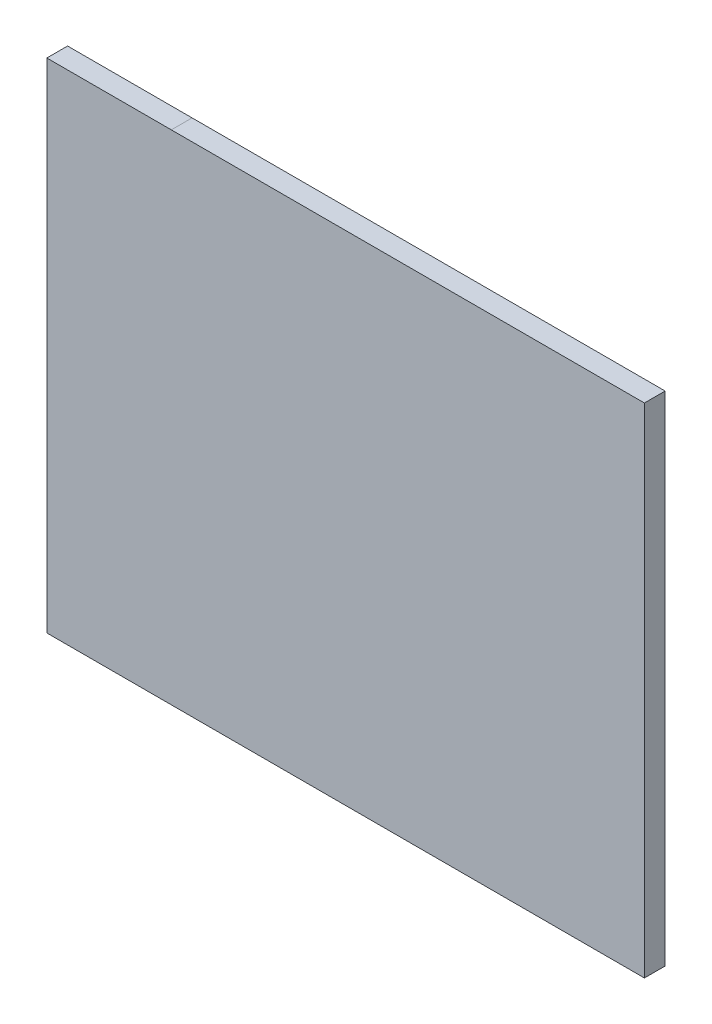
ISO-10303-21;
HEADER;
FILE_DESCRIPTION(('STEP AP214'),'2;1');
FILE_NAME('part.step','',(''),(''),'','','');
FILE_SCHEMA(('AUTOMOTIVE_DESIGN { 1 0 10303 214 1 1 1 1 }'));
ENDSEC;
DATA;
#1=APPLICATION_CONTEXT('core data for automotive mechanical design processes');
#2=APPLICATION_PROTOCOL_DEFINITION('international standard','automotive_design',2000,#1);
#3=PRODUCT_CONTEXT('',#1,'mechanical');
#4=PRODUCT('Part','Part','',(#3));
#5=PRODUCT_RELATED_PRODUCT_CATEGORY('part','',(#4));
#6=PRODUCT_DEFINITION_FORMATION('','',#4);
#7=PRODUCT_DEFINITION_CONTEXT('part definition',#1,'design');
#8=PRODUCT_DEFINITION('design','',#6,#7);
#9=PRODUCT_DEFINITION_SHAPE('','',#8);
#10=(LENGTH_UNIT() NAMED_UNIT(*) SI_UNIT(.MILLI.,.METRE.));
#11=(NAMED_UNIT(*) PLANE_ANGLE_UNIT() SI_UNIT($,.RADIAN.));
#12=(NAMED_UNIT(*) SI_UNIT($,.STERADIAN.) SOLID_ANGLE_UNIT());
#13=UNCERTAINTY_MEASURE_WITH_UNIT(LENGTH_MEASURE(1.E-05),#10,'distance_accuracy_value','');
#14=(GEOMETRIC_REPRESENTATION_CONTEXT(3) GLOBAL_UNCERTAINTY_ASSIGNED_CONTEXT((#13)) GLOBAL_UNIT_ASSIGNED_CONTEXT((#10,
#11,#12)) REPRESENTATION_CONTEXT('',''));
#15=CARTESIAN_POINT('',(0.,0.,0.));
#16=DIRECTION('',(0.,0.,1.));
#17=DIRECTION('',(1.,0.,0.));
#18=AXIS2_PLACEMENT_3D('',#15,#16,#17);
#19=CARTESIAN_POINT('',(0.,101.6,254.));
#20=DIRECTION('',(0.,-1.,0.));
#21=DIRECTION('',(0.,0.,-1.));
#22=AXIS2_PLACEMENT_3D('',#19,#20,#21);
#23=PLANE('',#22);
#24=DIRECTION('',(0.,0.,1.));
#25=VECTOR('',#24,1.);
#26=CARTESIAN_POINT('',(1524.,101.6,254.));
#27=LINE('',#26,#25);
#28=CARTESIAN_POINT('',(1524.,101.6,0.));
#29=VERTEX_POINT('',#28);
#30=CARTESIAN_POINT('',(1524.,101.6,254.));
#31=VERTEX_POINT('',#30);
#32=EDGE_CURVE('E12',#29,#31,#27,.T.);
#33=ORIENTED_EDGE('',*,*,#32,.F.);
#34=DIRECTION('',(-1.,0.,0.));
#35=VECTOR('',#34,1.);
#36=CARTESIAN_POINT('',(0.,101.6,0.));
#37=LINE('',#36,#35);
#38=CARTESIAN_POINT('',(0.,101.6,0.));
#39=VERTEX_POINT('',#38);
#40=EDGE_CURVE('E113',#29,#39,#37,.T.);
#41=ORIENTED_EDGE('',*,*,#40,.T.);
#42=DIRECTION('',(0.,0.,-1.));
#43=VECTOR('',#42,1.);
#44=CARTESIAN_POINT('',(0.,101.6,254.));
#45=LINE('',#44,#43);
#46=CARTESIAN_POINT('',(0.,101.6,254.));
#47=VERTEX_POINT('',#46);
#48=EDGE_CURVE('E109',#47,#39,#45,.T.);
#49=ORIENTED_EDGE('',*,*,#48,.F.);
#50=DIRECTION('',(-1.,0.,0.));
#51=VECTOR('',#50,1.);
#52=CARTESIAN_POINT('',(0.,101.6,254.));
#53=LINE('',#52,#51);
#54=EDGE_CURVE('E121',#31,#47,#53,.T.);
#55=ORIENTED_EDGE('',*,*,#54,.F.);
#56=EDGE_LOOP('',(#33,#41,#49,#55));
#57=FACE_BOUND('',#56,.T.);
#58=ADVANCED_FACE('F44',(#57),#23,.F.);
#59=CARTESIAN_POINT('',(0.,-5994.4,254.));
#60=DIRECTION('',(1.,0.,0.));
#61=DIRECTION('',(0.,0.,-1.));
#62=AXIS2_PLACEMENT_3D('',#59,#60,#61);
#63=PLANE('',#62);
#64=DIRECTION('',(0.,-1.,0.));
#65=VECTOR('',#64,1.);
#66=CARTESIAN_POINT('',(0.,-5994.4,0.));
#67=LINE('',#66,#65);
#68=CARTESIAN_POINT('',(0.,-5994.4,0.));
#69=VERTEX_POINT('',#68);
#70=EDGE_CURVE('E93',#39,#69,#67,.T.);
#71=ORIENTED_EDGE('',*,*,#70,.T.);
#72=DIRECTION('',(0.,0.,-1.));
#73=VECTOR('',#72,1.);
#74=CARTESIAN_POINT('',(0.,-5994.4,254.));
#75=LINE('',#74,#73);
#76=CARTESIAN_POINT('',(0.,-5994.4,254.));
#77=VERTEX_POINT('',#76);
#78=EDGE_CURVE('E53',#77,#69,#75,.T.);
#79=ORIENTED_EDGE('',*,*,#78,.F.);
#80=DIRECTION('',(0.,-1.,0.));
#81=VECTOR('',#80,1.);
#82=CARTESIAN_POINT('',(0.,-5994.4,254.));
#83=LINE('',#82,#81);
#84=EDGE_CURVE('E115',#47,#77,#83,.T.);
#85=ORIENTED_EDGE('',*,*,#84,.F.);
#86=ORIENTED_EDGE('',*,*,#48,.T.);
#87=EDGE_LOOP('',(#71,#79,#85,#86));
#88=FACE_BOUND('',#87,.T.);
#89=ADVANCED_FACE('F46',(#88),#63,.F.);
#90=CARTESIAN_POINT('',(0.,-5994.4,254.));
#91=DIRECTION('',(0.,1.,0.));
#92=DIRECTION('',(0.,0.,1.));
#93=AXIS2_PLACEMENT_3D('',#90,#91,#92);
#94=PLANE('',#93);
#95=DIRECTION('',(1.,0.,0.));
#96=VECTOR('',#95,1.);
#97=CARTESIAN_POINT('',(0.,-5994.4,0.));
#98=LINE('',#97,#96);
#99=CARTESIAN_POINT('',(7315.2,-5994.4,0.));
#100=VERTEX_POINT('',#99);
#101=EDGE_CURVE('E89',#69,#100,#98,.T.);
#102=ORIENTED_EDGE('',*,*,#101,.T.);
#103=DIRECTION('',(0.,0.,-1.));
#104=VECTOR('',#103,1.);
#105=CARTESIAN_POINT('',(7315.2,-5994.4,254.));
#106=LINE('',#105,#104);
#107=CARTESIAN_POINT('',(7315.2,-5994.4,254.));
#108=VERTEX_POINT('',#107);
#109=EDGE_CURVE('E106',#108,#100,#106,.T.);
#110=ORIENTED_EDGE('',*,*,#109,.F.);
#111=DIRECTION('',(1.,0.,0.));
#112=VECTOR('',#111,1.);
#113=CARTESIAN_POINT('',(0.,-5994.4,254.));
#114=LINE('',#113,#112);
#115=EDGE_CURVE('E102',#77,#108,#114,.T.);
#116=ORIENTED_EDGE('',*,*,#115,.F.);
#117=ORIENTED_EDGE('',*,*,#78,.T.);
#118=EDGE_LOOP('',(#102,#110,#116,#117));
#119=FACE_BOUND('',#118,.T.);
#120=ADVANCED_FACE('F101',(#119),#94,.F.);
#121=CARTESIAN_POINT('',(7315.2,-5994.4,254.));
#122=DIRECTION('',(-1.,0.,0.));
#123=DIRECTION('',(0.,0.,1.));
#124=AXIS2_PLACEMENT_3D('',#121,#122,#123);
#125=PLANE('',#124);
#126=DIRECTION('',(0.,1.,0.));
#127=VECTOR('',#126,1.);
#128=CARTESIAN_POINT('',(7315.2,-5994.4,0.));
#129=LINE('',#128,#127);
#130=CARTESIAN_POINT('',(7315.2,101.6,0.));
#131=VERTEX_POINT('',#130);
#132=EDGE_CURVE('E95',#100,#131,#129,.T.);
#133=ORIENTED_EDGE('',*,*,#132,.T.);
#134=DIRECTION('',(0.,0.,-1.));
#135=VECTOR('',#134,1.);
#136=CARTESIAN_POINT('',(7315.2,101.6,254.));
#137=LINE('',#136,#135);
#138=CARTESIAN_POINT('',(7315.2,101.6,254.));
#139=VERTEX_POINT('',#138);
#140=EDGE_CURVE('E126',#139,#131,#137,.T.);
#141=ORIENTED_EDGE('',*,*,#140,.F.);
#142=DIRECTION('',(0.,1.,0.));
#143=VECTOR('',#142,1.);
#144=CARTESIAN_POINT('',(7315.2,-5994.4,254.));
#145=LINE('',#144,#143);
#146=EDGE_CURVE('E119',#108,#139,#145,.T.);
#147=ORIENTED_EDGE('',*,*,#146,.F.);
#148=ORIENTED_EDGE('',*,*,#109,.T.);
#149=EDGE_LOOP('',(#133,#141,#147,#148));
#150=FACE_BOUND('',#149,.T.);
#151=ADVANCED_FACE('F131',(#150),#125,.F.);
#152=EDGE_CURVE('E114',#131,#29,#37,.T.);
#153=ORIENTED_EDGE('',*,*,#152,.T.);
#154=ORIENTED_EDGE('',*,*,#32,.T.);
#155=EDGE_CURVE('E122',#139,#31,#53,.T.);
#156=ORIENTED_EDGE('',*,*,#155,.F.);
#157=ORIENTED_EDGE('',*,*,#140,.T.);
#158=EDGE_LOOP('',(#153,#154,#156,#157));
#159=FACE_BOUND('',#158,.T.);
#160=ADVANCED_FACE('F135',(#159),#23,.F.);
#161=CARTESIAN_POINT('',(0.,101.6,254.));
#162=DIRECTION('',(0.,0.,-1.));
#163=DIRECTION('',(-1.,0.,0.));
#164=AXIS2_PLACEMENT_3D('',#161,#162,#163);
#165=PLANE('',#164);
#166=ORIENTED_EDGE('',*,*,#84,.T.);
#167=ORIENTED_EDGE('',*,*,#115,.T.);
#168=ORIENTED_EDGE('',*,*,#146,.T.);
#169=ORIENTED_EDGE('',*,*,#155,.T.);
#170=ORIENTED_EDGE('',*,*,#54,.T.);
#171=EDGE_LOOP('',(#166,#167,#168,#169,#170));
#172=FACE_BOUND('',#171,.T.);
#173=ADVANCED_FACE('F134',(#172),#165,.F.);
#174=CARTESIAN_POINT('',(0.,101.6,0.));
#175=DIRECTION('',(0.,0.,-1.));
#176=DIRECTION('',(-1.,0.,0.));
#177=AXIS2_PLACEMENT_3D('',#174,#175,#176);
#178=PLANE('',#177);
#179=ORIENTED_EDGE('',*,*,#70,.F.);
#180=ORIENTED_EDGE('',*,*,#40,.F.);
#181=ORIENTED_EDGE('',*,*,#152,.F.);
#182=ORIENTED_EDGE('',*,*,#132,.F.);
#183=ORIENTED_EDGE('',*,*,#101,.F.);
#184=EDGE_LOOP('',(#179,#180,#181,#182,#183));
#185=FACE_BOUND('',#184,.T.);
#186=ADVANCED_FACE('F91',(#185),#178,.T.);
#187=CLOSED_SHELL('',(#58,#89,#120,#151,#160,#173,#186));
#188=MANIFOLD_SOLID_BREP('B2',#187);
#189=ADVANCED_BREP_SHAPE_REPRESENTATION('',(#18,#188),#14);
#190=SHAPE_DEFINITION_REPRESENTATION(#9,#189);
ENDSEC;
END-ISO-10303-21;
